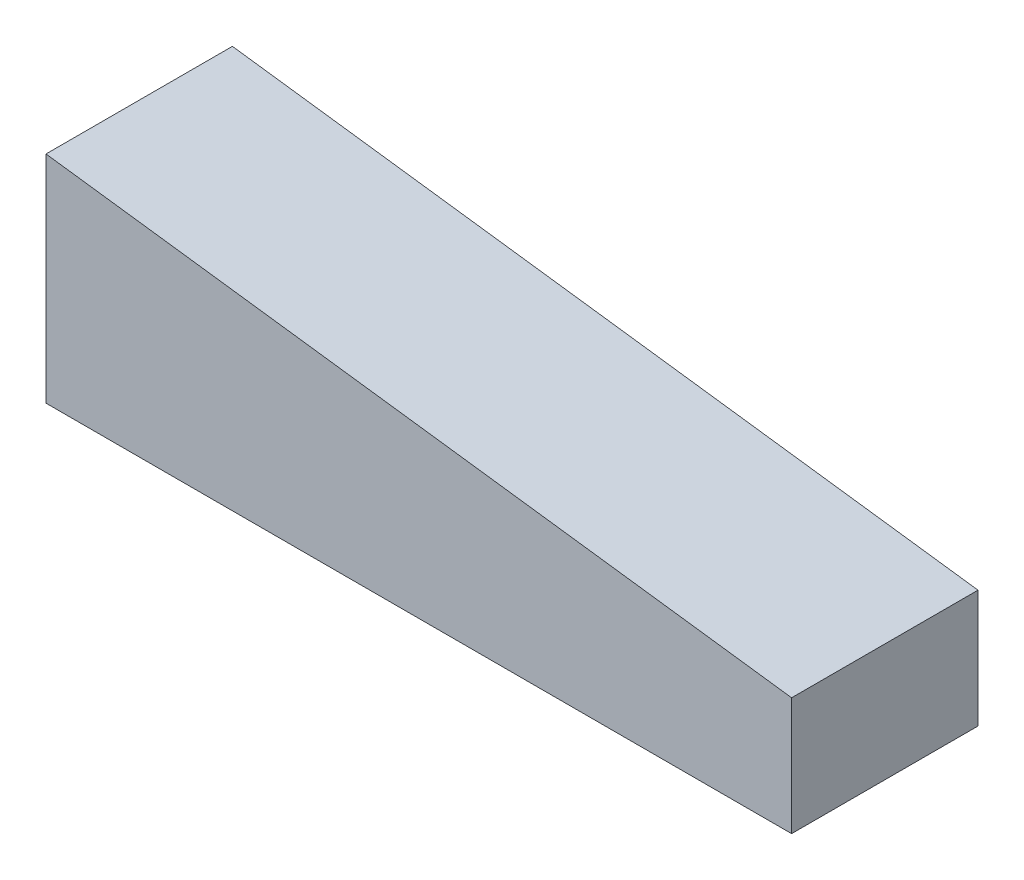
ISO-10303-21;
HEADER;
FILE_DESCRIPTION(('STEP AP214'),'2;1');
FILE_NAME('part.step','',(''),(''),'','','');
FILE_SCHEMA(('AUTOMOTIVE_DESIGN { 1 0 10303 214 1 1 1 1 }'));
ENDSEC;
DATA;
#1=APPLICATION_CONTEXT('core data for automotive mechanical design processes');
#2=APPLICATION_PROTOCOL_DEFINITION('international standard','automotive_design',2000,#1);
#3=PRODUCT_CONTEXT('',#1,'mechanical');
#4=PRODUCT('Part','Part','',(#3));
#5=PRODUCT_RELATED_PRODUCT_CATEGORY('part','',(#4));
#6=PRODUCT_DEFINITION_FORMATION('','',#4);
#7=PRODUCT_DEFINITION_CONTEXT('part definition',#1,'design');
#8=PRODUCT_DEFINITION('design','',#6,#7);
#9=PRODUCT_DEFINITION_SHAPE('','',#8);
#10=(LENGTH_UNIT() NAMED_UNIT(*) SI_UNIT(.MILLI.,.METRE.));
#11=(NAMED_UNIT(*) PLANE_ANGLE_UNIT() SI_UNIT($,.RADIAN.));
#12=(NAMED_UNIT(*) SI_UNIT($,.STERADIAN.) SOLID_ANGLE_UNIT());
#13=UNCERTAINTY_MEASURE_WITH_UNIT(LENGTH_MEASURE(1.E-05),#10,'distance_accuracy_value','');
#14=(GEOMETRIC_REPRESENTATION_CONTEXT(3) GLOBAL_UNCERTAINTY_ASSIGNED_CONTEXT((#13)) GLOBAL_UNIT_ASSIGNED_CONTEXT((#10,
#11,#12)) REPRESENTATION_CONTEXT('',''));
#15=CARTESIAN_POINT('',(0.,0.,0.));
#16=DIRECTION('',(0.,0.,1.));
#17=DIRECTION('',(1.,0.,0.));
#18=AXIS2_PLACEMENT_3D('',#15,#16,#17);
#19=CARTESIAN_POINT('',(50.8,0.,6.35));
#20=DIRECTION('',(0.,1.,0.));
#21=DIRECTION('',(-1.,0.,0.));
#22=AXIS2_PLACEMENT_3D('',#19,#20,#21);
#23=PLANE('',#22);
#24=DIRECTION('',(1.,0.,0.));
#25=VECTOR('',#24,1.);
#26=CARTESIAN_POINT('',(50.8,0.,-6.35));
#27=LINE('',#26,#25);
#28=CARTESIAN_POINT('',(0.,0.,-6.35));
#29=VERTEX_POINT('',#28);
#30=CARTESIAN_POINT('',(50.8,0.,-6.35));
#31=VERTEX_POINT('',#30);
#32=EDGE_CURVE('E104',#29,#31,#27,.T.);
#33=ORIENTED_EDGE('',*,*,#32,.T.);
#34=DIRECTION('',(0.,0.,-1.));
#35=VECTOR('',#34,1.);
#36=CARTESIAN_POINT('',(50.8,0.,6.35));
#37=LINE('',#36,#35);
#38=CARTESIAN_POINT('',(50.8,0.,6.35));
#39=VERTEX_POINT('',#38);
#40=EDGE_CURVE('E11',#39,#31,#37,.T.);
#41=ORIENTED_EDGE('',*,*,#40,.F.);
#42=DIRECTION('',(1.,0.,0.));
#43=VECTOR('',#42,1.);
#44=CARTESIAN_POINT('',(50.8,0.,6.35));
#45=LINE('',#44,#43);
#46=CARTESIAN_POINT('',(0.,0.,6.35));
#47=VERTEX_POINT('',#46);
#48=EDGE_CURVE('E87',#47,#39,#45,.T.);
#49=ORIENTED_EDGE('',*,*,#48,.F.);
#50=DIRECTION('',(0.,0.,-1.));
#51=VECTOR('',#50,1.);
#52=CARTESIAN_POINT('',(0.,0.,6.35));
#53=LINE('',#52,#51);
#54=EDGE_CURVE('E100',#47,#29,#53,.T.);
#55=ORIENTED_EDGE('',*,*,#54,.T.);
#56=EDGE_LOOP('',(#33,#41,#49,#55));
#57=FACE_BOUND('',#56,.T.);
#58=ADVANCED_FACE('F35',(#57),#23,.F.);
#59=CARTESIAN_POINT('',(50.8,8.01843718579245,6.35));
#60=DIRECTION('',(-1.,0.,0.));
#61=DIRECTION('',(0.,0.,1.));
#62=AXIS2_PLACEMENT_3D('',#59,#60,#61);
#63=PLANE('',#62);
#64=DIRECTION('',(0.,1.,0.));
#65=VECTOR('',#64,1.);
#66=CARTESIAN_POINT('',(50.8,8.01843718579245,-6.35));
#67=LINE('',#66,#65);
#68=CARTESIAN_POINT('',(50.8,8.01843718579245,-6.35));
#69=VERTEX_POINT('',#68);
#70=EDGE_CURVE('E91',#31,#69,#67,.T.);
#71=ORIENTED_EDGE('',*,*,#70,.T.);
#72=DIRECTION('',(0.,0.,-1.));
#73=VECTOR('',#72,1.);
#74=CARTESIAN_POINT('',(50.8,8.01843718579245,6.35));
#75=LINE('',#74,#73);
#76=CARTESIAN_POINT('',(50.8,8.01843718579245,6.35));
#77=VERTEX_POINT('',#76);
#78=EDGE_CURVE('E44',#77,#69,#75,.T.);
#79=ORIENTED_EDGE('',*,*,#78,.F.);
#80=DIRECTION('',(0.,1.,0.));
#81=VECTOR('',#80,1.);
#82=CARTESIAN_POINT('',(50.8,8.01843718579245,6.35));
#83=LINE('',#82,#81);
#84=EDGE_CURVE('E82',#39,#77,#83,.T.);
#85=ORIENTED_EDGE('',*,*,#84,.F.);
#86=ORIENTED_EDGE('',*,*,#40,.T.);
#87=EDGE_LOOP('',(#71,#79,#85,#86));
#88=FACE_BOUND('',#87,.T.);
#89=ADVANCED_FACE('F90',(#88),#63,.F.);
#90=CARTESIAN_POINT('',(0.,14.7063840632318,6.35));
#91=DIRECTION('',(-0.130526192220045,-0.991444861373811,0.));
#92=DIRECTION('',(0.991444861373811,-0.130526192220045,0.));
#93=AXIS2_PLACEMENT_3D('',#90,#91,#92);
#94=PLANE('',#93);
#95=DIRECTION('',(-0.991444861373811,0.130526192220045,0.));
#96=VECTOR('',#95,1.);
#97=CARTESIAN_POINT('',(0.,14.7063840632318,-6.35));
#98=LINE('',#97,#96);
#99=CARTESIAN_POINT('',(0.,14.7063840632318,-6.35));
#100=VERTEX_POINT('',#99);
#101=EDGE_CURVE('E69',#69,#100,#98,.T.);
#102=ORIENTED_EDGE('',*,*,#101,.T.);
#103=DIRECTION('',(0.,0.,-1.));
#104=VECTOR('',#103,1.);
#105=CARTESIAN_POINT('',(0.,14.7063840632318,6.35));
#106=LINE('',#105,#104);
#107=CARTESIAN_POINT('',(0.,14.7063840632318,6.35));
#108=VERTEX_POINT('',#107);
#109=EDGE_CURVE('E93',#108,#100,#106,.T.);
#110=ORIENTED_EDGE('',*,*,#109,.F.);
#111=DIRECTION('',(-0.991444861373811,0.130526192220045,0.));
#112=VECTOR('',#111,1.);
#113=CARTESIAN_POINT('',(0.,14.7063840632318,6.35));
#114=LINE('',#113,#112);
#115=EDGE_CURVE('E85',#77,#108,#114,.T.);
#116=ORIENTED_EDGE('',*,*,#115,.F.);
#117=ORIENTED_EDGE('',*,*,#78,.T.);
#118=EDGE_LOOP('',(#102,#110,#116,#117));
#119=FACE_BOUND('',#118,.T.);
#120=ADVANCED_FACE('F94',(#119),#94,.F.);
#121=CARTESIAN_POINT('',(0.,0.,6.35));
#122=DIRECTION('',(1.,0.,0.));
#123=DIRECTION('',(0.,1.,0.));
#124=AXIS2_PLACEMENT_3D('',#121,#122,#123);
#125=PLANE('',#124);
#126=DIRECTION('',(0.,-1.,0.));
#127=VECTOR('',#126,1.);
#128=CARTESIAN_POINT('',(0.,0.,-6.35));
#129=LINE('',#128,#127);
#130=EDGE_CURVE('E75',#100,#29,#129,.T.);
#131=ORIENTED_EDGE('',*,*,#130,.T.);
#132=ORIENTED_EDGE('',*,*,#54,.F.);
#133=DIRECTION('',(0.,-1.,0.));
#134=VECTOR('',#133,1.);
#135=CARTESIAN_POINT('',(0.,0.,6.35));
#136=LINE('',#135,#134);
#137=EDGE_CURVE('E52',#108,#47,#136,.T.);
#138=ORIENTED_EDGE('',*,*,#137,.F.);
#139=ORIENTED_EDGE('',*,*,#109,.T.);
#140=EDGE_LOOP('',(#131,#132,#138,#139));
#141=FACE_BOUND('',#140,.T.);
#142=ADVANCED_FACE('F119',(#141),#125,.F.);
#143=CARTESIAN_POINT('',(0.,0.,6.35));
#144=DIRECTION('',(0.,0.,-1.));
#145=DIRECTION('',(-1.,0.,0.));
#146=AXIS2_PLACEMENT_3D('',#143,#144,#145);
#147=PLANE('',#146);
#148=ORIENTED_EDGE('',*,*,#48,.T.);
#149=ORIENTED_EDGE('',*,*,#84,.T.);
#150=ORIENTED_EDGE('',*,*,#115,.T.);
#151=ORIENTED_EDGE('',*,*,#137,.T.);
#152=EDGE_LOOP('',(#148,#149,#150,#151));
#153=FACE_BOUND('',#152,.T.);
#154=ADVANCED_FACE('F83',(#153),#147,.F.);
#155=CARTESIAN_POINT('',(0.,0.,-6.35));
#156=DIRECTION('',(0.,0.,-1.));
#157=DIRECTION('',(-1.,0.,0.));
#158=AXIS2_PLACEMENT_3D('',#155,#156,#157);
#159=PLANE('',#158);
#160=ORIENTED_EDGE('',*,*,#32,.F.);
#161=ORIENTED_EDGE('',*,*,#130,.F.);
#162=ORIENTED_EDGE('',*,*,#101,.F.);
#163=ORIENTED_EDGE('',*,*,#70,.F.);
#164=EDGE_LOOP('',(#160,#161,#162,#163));
#165=FACE_BOUND('',#164,.T.);
#166=ADVANCED_FACE('F122',(#165),#159,.T.);
#167=CLOSED_SHELL('',(#58,#89,#120,#142,#154,#166));
#168=MANIFOLD_SOLID_BREP('B2',#167);
#169=ADVANCED_BREP_SHAPE_REPRESENTATION('',(#18,#168),#14);
#170=SHAPE_DEFINITION_REPRESENTATION(#9,#169);
ENDSEC;
END-ISO-10303-21;
